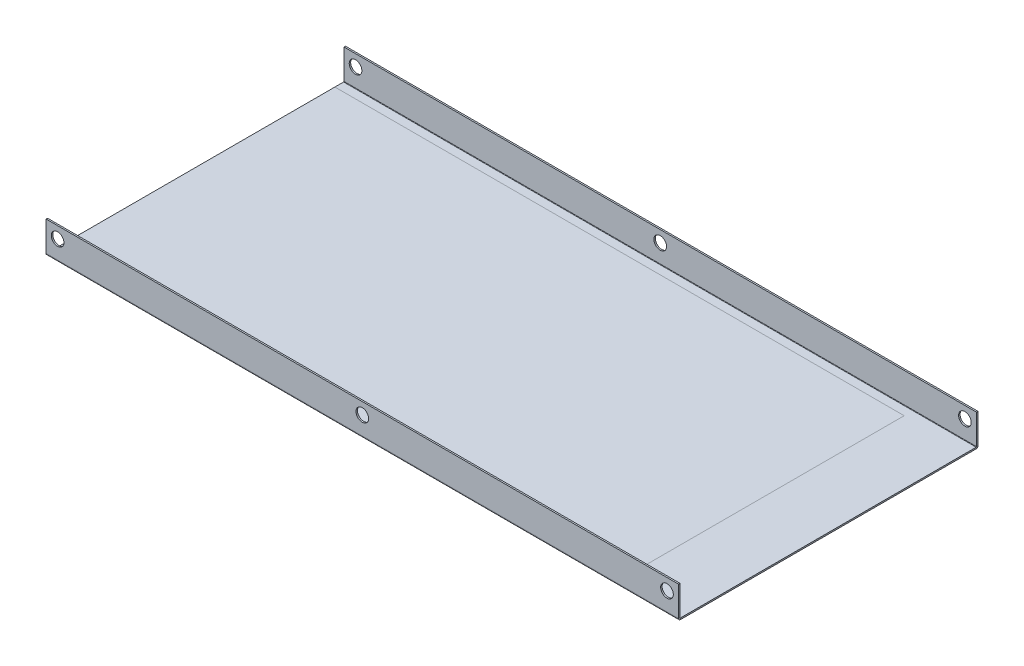
ISO-10303-21;
HEADER;
FILE_DESCRIPTION(('STEP AP214'),'2;1');
FILE_NAME('part.step','',(''),(''),'','','');
FILE_SCHEMA(('AUTOMOTIVE_DESIGN { 1 0 10303 214 1 1 1 1 }'));
ENDSEC;
DATA;
#1=APPLICATION_CONTEXT('core data for automotive mechanical design processes');
#2=APPLICATION_PROTOCOL_DEFINITION('international standard','automotive_design',2000,#1);
#3=PRODUCT_CONTEXT('',#1,'mechanical');
#4=PRODUCT('Part','Part','',(#3));
#5=PRODUCT_RELATED_PRODUCT_CATEGORY('part','',(#4));
#6=PRODUCT_DEFINITION_FORMATION('','',#4);
#7=PRODUCT_DEFINITION_CONTEXT('part definition',#1,'design');
#8=PRODUCT_DEFINITION('design','',#6,#7);
#9=PRODUCT_DEFINITION_SHAPE('','',#8);
#10=(LENGTH_UNIT() NAMED_UNIT(*) SI_UNIT(.MILLI.,.METRE.));
#11=(NAMED_UNIT(*) PLANE_ANGLE_UNIT() SI_UNIT($,.RADIAN.));
#12=(NAMED_UNIT(*) SI_UNIT($,.STERADIAN.) SOLID_ANGLE_UNIT());
#13=UNCERTAINTY_MEASURE_WITH_UNIT(LENGTH_MEASURE(1.E-05),#10,'distance_accuracy_value','');
#14=(GEOMETRIC_REPRESENTATION_CONTEXT(3) GLOBAL_UNCERTAINTY_ASSIGNED_CONTEXT((#13)) GLOBAL_UNIT_ASSIGNED_CONTEXT((#10,
#11,#12)) REPRESENTATION_CONTEXT('',''));
#15=CARTESIAN_POINT('',(0.,0.,0.));
#16=DIRECTION('',(0.,0.,1.));
#17=DIRECTION('',(1.,0.,0.));
#18=AXIS2_PLACEMENT_3D('',#15,#16,#17);
#19=CARTESIAN_POINT('',(-150.,-0.710000000000019,-66.));
#20=DIRECTION('',(0.,0.,1.));
#21=DIRECTION('',(1.,0.,0.));
#22=AXIS2_PLACEMENT_3D('',#19,#20,#21);
#23=PLANE('',#22);
#24=DIRECTION('',(-1.,0.,0.));
#25=VECTOR('',#24,1.);
#26=CARTESIAN_POINT('',(0.,-0.7,-66.));
#27=LINE('',#26,#25);
#28=CARTESIAN_POINT('',(120.,-0.7,-66.));
#29=VERTEX_POINT('',#28);
#30=CARTESIAN_POINT('',(-150.,-0.7,-66.));
#31=VERTEX_POINT('',#30);
#32=EDGE_CURVE('E255',#29,#31,#27,.T.);
#33=ORIENTED_EDGE('',*,*,#32,.F.);
#34=DIRECTION('',(0.,1.,0.));
#35=VECTOR('',#34,1.);
#36=CARTESIAN_POINT('',(120.,-0.710000000000019,-66.));
#37=LINE('',#36,#35);
#38=CARTESIAN_POINT('',(120.,0.,-66.));
#39=VERTEX_POINT('',#38);
#40=EDGE_CURVE('E100',#29,#39,#37,.T.);
#41=ORIENTED_EDGE('',*,*,#40,.T.);
#42=DIRECTION('',(-1.,0.,0.));
#43=VECTOR('',#42,1.);
#44=CARTESIAN_POINT('',(0.,0.,-66.));
#45=LINE('',#44,#43);
#46=CARTESIAN_POINT('',(-150.,0.,-66.));
#47=VERTEX_POINT('',#46);
#48=EDGE_CURVE('E261',#39,#47,#45,.T.);
#49=ORIENTED_EDGE('',*,*,#48,.T.);
#50=DIRECTION('',(0.,1.,0.));
#51=VECTOR('',#50,1.);
#52=CARTESIAN_POINT('',(-150.,-0.7,-66.));
#53=LINE('',#52,#51);
#54=EDGE_CURVE('E260',#31,#47,#53,.T.);
#55=ORIENTED_EDGE('',*,*,#54,.F.);
#56=EDGE_LOOP('',(#33,#41,#49,#55));
#57=FACE_BOUND('',#56,.T.);
#58=ADVANCED_FACE('F90',(#57),#23,.T.);
#59=CARTESIAN_POINT('',(120.,-0.710000000000019,66.));
#60=DIRECTION('',(0.,0.,-1.));
#61=DIRECTION('',(-1.,0.,0.));
#62=AXIS2_PLACEMENT_3D('',#59,#60,#61);
#63=PLANE('',#62);
#64=DIRECTION('',(1.,0.,0.));
#65=VECTOR('',#64,1.);
#66=CARTESIAN_POINT('',(0.,-0.7,66.));
#67=LINE('',#66,#65);
#68=CARTESIAN_POINT('',(-150.,-0.7,66.));
#69=VERTEX_POINT('',#68);
#70=CARTESIAN_POINT('',(120.,-0.7,66.));
#71=VERTEX_POINT('',#70);
#72=EDGE_CURVE('E258',#69,#71,#67,.T.);
#73=ORIENTED_EDGE('',*,*,#72,.F.);
#74=DIRECTION('',(0.,-1.,0.));
#75=VECTOR('',#74,1.);
#76=CARTESIAN_POINT('',(-150.,-0.7,66.));
#77=LINE('',#76,#75);
#78=CARTESIAN_POINT('',(-150.,0.,66.));
#79=VERTEX_POINT('',#78);
#80=EDGE_CURVE('E270',#79,#69,#77,.T.);
#81=ORIENTED_EDGE('',*,*,#80,.F.);
#82=DIRECTION('',(1.,0.,0.));
#83=VECTOR('',#82,1.);
#84=CARTESIAN_POINT('',(0.,0.,66.));
#85=LINE('',#84,#83);
#86=CARTESIAN_POINT('',(120.,0.,66.));
#87=VERTEX_POINT('',#86);
#88=EDGE_CURVE('E267',#79,#87,#85,.T.);
#89=ORIENTED_EDGE('',*,*,#88,.T.);
#90=DIRECTION('',(0.,1.,0.));
#91=VECTOR('',#90,1.);
#92=CARTESIAN_POINT('',(120.,-0.710000000000019,66.));
#93=LINE('',#92,#91);
#94=EDGE_CURVE('E14',#71,#87,#93,.T.);
#95=ORIENTED_EDGE('',*,*,#94,.F.);
#96=EDGE_LOOP('',(#73,#81,#89,#95));
#97=FACE_BOUND('',#96,.T.);
#98=ADVANCED_FACE('F495',(#97),#63,.T.);
#99=CARTESIAN_POINT('',(120.,-0.710000000000019,-66.));
#100=DIRECTION('',(-1.,0.,0.));
#101=DIRECTION('',(0.,0.,1.));
#102=AXIS2_PLACEMENT_3D('',#99,#100,#101);
#103=PLANE('',#102);
#104=DIRECTION('',(0.,0.,-1.));
#105=VECTOR('',#104,1.);
#106=CARTESIAN_POINT('',(120.,-0.7,0.));
#107=LINE('',#106,#105);
#108=EDGE_CURVE('E241',#71,#29,#107,.T.);
#109=ORIENTED_EDGE('',*,*,#108,.F.);
#110=ORIENTED_EDGE('',*,*,#94,.T.);
#111=DIRECTION('',(0.,0.,-1.));
#112=VECTOR('',#111,1.);
#113=CARTESIAN_POINT('',(120.,0.,0.));
#114=LINE('',#113,#112);
#115=EDGE_CURVE('E243',#87,#39,#114,.T.);
#116=ORIENTED_EDGE('',*,*,#115,.T.);
#117=ORIENTED_EDGE('',*,*,#40,.F.);
#118=EDGE_LOOP('',(#109,#110,#116,#117));
#119=FACE_BOUND('',#118,.T.);
#120=ADVANCED_FACE('F240',(#119),#103,.T.);
#121=CARTESIAN_POINT('',(-144.5,8.80000000000007,-61.));
#122=DIRECTION('',(0.,0.,-1.));
#123=DIRECTION('',(0.,1.,0.));
#124=AXIS2_PLACEMENT_3D('',#121,#122,#123);
#125=CYLINDRICAL_SURFACE('',#124,2.99999999999999);
#126=CARTESIAN_POINT('',(-144.5,8.80000000000004,-70.3));
#127=DIRECTION('',(0.,0.,1.));
#128=DIRECTION('',(0.,-1.,0.));
#129=AXIS2_PLACEMENT_3D('',#126,#127,#128);
#130=CIRCLE('',#129,2.99999999999999);
#131=CARTESIAN_POINT('',(-144.5,5.80000000000004,-70.3));
#132=VERTEX_POINT('',#131);
#133=EDGE_CURVE('E291',#132,#132,#130,.T.);
#134=ORIENTED_EDGE('',*,*,#133,.T.);
#135=EDGE_LOOP('',(#134));
#136=FACE_BOUND('',#135,.T.);
#137=CARTESIAN_POINT('',(-144.5,8.80000000000003,-71.));
#138=DIRECTION('',(0.,0.,-1.));
#139=DIRECTION('',(0.,-1.,0.));
#140=AXIS2_PLACEMENT_3D('',#137,#138,#139);
#141=CIRCLE('',#140,2.99999999999999);
#142=CARTESIAN_POINT('',(-144.5,5.80000000000004,-71.));
#143=VERTEX_POINT('',#142);
#144=EDGE_CURVE('E294',#143,#143,#141,.T.);
#145=ORIENTED_EDGE('',*,*,#144,.T.);
#146=EDGE_LOOP('',(#145));
#147=FACE_BOUND('',#146,.T.);
#148=ADVANCED_FACE('F482',(#136,#147),#125,.F.);
#149=CARTESIAN_POINT('',(0.,8.80000000000004,-61.));
#150=DIRECTION('',(0.,0.,-1.));
#151=DIRECTION('',(0.,1.,0.));
#152=AXIS2_PLACEMENT_3D('',#149,#150,#151);
#153=CYLINDRICAL_SURFACE('',#152,3.);
#154=CARTESIAN_POINT('',(0.,8.80000000000001,-70.3));
#155=DIRECTION('',(0.,0.,1.));
#156=DIRECTION('',(0.,-1.,0.));
#157=AXIS2_PLACEMENT_3D('',#154,#155,#156);
#158=CIRCLE('',#157,3.);
#159=CARTESIAN_POINT('',(0.,5.80000000000001,-70.3));
#160=VERTEX_POINT('',#159);
#161=EDGE_CURVE('E390',#160,#160,#158,.T.);
#162=ORIENTED_EDGE('',*,*,#161,.T.);
#163=EDGE_LOOP('',(#162));
#164=FACE_BOUND('',#163,.T.);
#165=CARTESIAN_POINT('',(0.,8.80000000000001,-71.));
#166=DIRECTION('',(0.,0.,-1.));
#167=DIRECTION('',(0.,1.,0.));
#168=AXIS2_PLACEMENT_3D('',#165,#166,#167);
#169=CIRCLE('',#168,3.);
#170=CARTESIAN_POINT('',(0.,11.8,-71.));
#171=VERTEX_POINT('',#170);
#172=EDGE_CURVE('E290',#171,#171,#169,.T.);
#173=ORIENTED_EDGE('',*,*,#172,.T.);
#174=EDGE_LOOP('',(#173));
#175=FACE_BOUND('',#174,.T.);
#176=ADVANCED_FACE('F484',(#164,#175),#153,.F.);
#177=CARTESIAN_POINT('',(144.5,8.80000000000004,-61.));
#178=DIRECTION('',(0.,0.,-1.));
#179=DIRECTION('',(0.,1.,0.));
#180=AXIS2_PLACEMENT_3D('',#177,#178,#179);
#181=CYLINDRICAL_SURFACE('',#180,2.99999999999999);
#182=CARTESIAN_POINT('',(144.5,8.8,-70.3));
#183=DIRECTION('',(0.,0.,1.));
#184=DIRECTION('',(0.,-1.,0.));
#185=AXIS2_PLACEMENT_3D('',#182,#183,#184);
#186=CIRCLE('',#185,2.99999999999999);
#187=CARTESIAN_POINT('',(144.5,5.80000000000001,-70.3));
#188=VERTEX_POINT('',#187);
#189=EDGE_CURVE('E323',#188,#188,#186,.T.);
#190=ORIENTED_EDGE('',*,*,#189,.T.);
#191=EDGE_LOOP('',(#190));
#192=FACE_BOUND('',#191,.T.);
#193=CARTESIAN_POINT('',(144.5,8.8,-71.));
#194=DIRECTION('',(0.,0.,-1.));
#195=DIRECTION('',(0.,1.,0.));
#196=AXIS2_PLACEMENT_3D('',#193,#194,#195);
#197=CIRCLE('',#196,2.99999999999999);
#198=CARTESIAN_POINT('',(144.5,11.8,-71.));
#199=VERTEX_POINT('',#198);
#200=EDGE_CURVE('E287',#199,#199,#197,.T.);
#201=ORIENTED_EDGE('',*,*,#200,.T.);
#202=EDGE_LOOP('',(#201));
#203=FACE_BOUND('',#202,.T.);
#204=ADVANCED_FACE('F491',(#192,#203),#181,.F.);
#205=CARTESIAN_POINT('',(150.,0.,-71.));
#206=DIRECTION('',(-1.,0.,0.));
#207=DIRECTION('',(0.,0.,1.));
#208=AXIS2_PLACEMENT_3D('',#205,#206,#207);
#209=PLANE('',#208);
#210=DIRECTION('',(0.,0.,1.));
#211=VECTOR('',#210,1.);
#212=CARTESIAN_POINT('',(150.,0.200000000000011,-71.));
#213=LINE('',#212,#211);
#214=CARTESIAN_POINT('',(150.,0.200000000000007,-70.3));
#215=VERTEX_POINT('',#214);
#216=CARTESIAN_POINT('',(150.,0.200000000000004,-71.));
#217=VERTEX_POINT('',#216);
#218=EDGE_CURVE('E190',#215,#217,#213,.F.);
#219=ORIENTED_EDGE('',*,*,#218,.T.);
#220=DIRECTION('',(0.,-1.,0.));
#221=VECTOR('',#220,1.);
#222=CARTESIAN_POINT('',(150.,-2.78058843749729E-13,-71.));
#223=LINE('',#222,#221);
#224=CARTESIAN_POINT('',(150.,14.3,-71.));
#225=VERTEX_POINT('',#224);
#226=EDGE_CURVE('E348',#225,#217,#223,.T.);
#227=ORIENTED_EDGE('',*,*,#226,.F.);
#228=DIRECTION('',(0.,0.,1.));
#229=VECTOR('',#228,1.);
#230=CARTESIAN_POINT('',(150.,14.3,-71.));
#231=LINE('',#230,#229);
#232=CARTESIAN_POINT('',(150.,14.3,-70.3));
#233=VERTEX_POINT('',#232);
#234=EDGE_CURVE('E344',#225,#233,#231,.T.);
#235=ORIENTED_EDGE('',*,*,#234,.T.);
#236=DIRECTION('',(0.,1.,0.));
#237=VECTOR('',#236,1.);
#238=CARTESIAN_POINT('',(150.,0.,-70.3));
#239=LINE('',#238,#237);
#240=EDGE_CURVE('E353',#233,#215,#239,.F.);
#241=ORIENTED_EDGE('',*,*,#240,.T.);
#242=EDGE_LOOP('',(#219,#227,#235,#241));
#243=FACE_BOUND('',#242,.T.);
#244=ADVANCED_FACE('F460',(#243),#209,.F.);
#245=CARTESIAN_POINT('',(150.,14.3,71.));
#246=DIRECTION('',(-1.,0.,0.));
#247=DIRECTION('',(0.,0.,1.));
#248=AXIS2_PLACEMENT_3D('',#245,#246,#247);
#249=PLANE('',#248);
#250=DIRECTION('',(0.,0.,-1.));
#251=VECTOR('',#250,1.);
#252=CARTESIAN_POINT('',(150.,0.20000000000002,70.3));
#253=LINE('',#252,#251);
#254=CARTESIAN_POINT('',(150.,0.200000000000013,70.3));
#255=VERTEX_POINT('',#254);
#256=CARTESIAN_POINT('',(150.,0.20000000000002,71.));
#257=VERTEX_POINT('',#256);
#258=EDGE_CURVE('E318',#255,#257,#253,.F.);
#259=ORIENTED_EDGE('',*,*,#258,.F.);
#260=DIRECTION('',(0.,-1.,0.));
#261=VECTOR('',#260,1.);
#262=CARTESIAN_POINT('',(150.,14.3,70.3));
#263=LINE('',#262,#261);
#264=CARTESIAN_POINT('',(150.,14.3,70.3));
#265=VERTEX_POINT('',#264);
#266=EDGE_CURVE('E314',#255,#265,#263,.F.);
#267=ORIENTED_EDGE('',*,*,#266,.T.);
#268=DIRECTION('',(0.,0.,-1.));
#269=VECTOR('',#268,1.);
#270=CARTESIAN_POINT('',(150.,14.3,71.));
#271=LINE('',#270,#269);
#272=CARTESIAN_POINT('',(150.,14.3,71.));
#273=VERTEX_POINT('',#272);
#274=EDGE_CURVE('E298',#273,#265,#271,.T.);
#275=ORIENTED_EDGE('',*,*,#274,.F.);
#276=DIRECTION('',(0.,1.,0.));
#277=VECTOR('',#276,1.);
#278=CARTESIAN_POINT('',(150.,0.,71.));
#279=LINE('',#278,#277);
#280=EDGE_CURVE('E125',#257,#273,#279,.T.);
#281=ORIENTED_EDGE('',*,*,#280,.F.);
#282=EDGE_LOOP('',(#259,#267,#275,#281));
#283=FACE_BOUND('',#282,.T.);
#284=ADVANCED_FACE('F422',(#283),#249,.F.);
#285=CARTESIAN_POINT('',(144.5,8.80000000000004,61.));
#286=DIRECTION('',(0.,0.,1.));
#287=DIRECTION('',(1.,0.,0.));
#288=AXIS2_PLACEMENT_3D('',#285,#286,#287);
#289=CYLINDRICAL_SURFACE('',#288,2.99999999999999);
#290=CARTESIAN_POINT('',(144.5,8.80000000000004,70.3));
#291=DIRECTION('',(0.,0.,-1.));
#292=DIRECTION('',(-1.,0.,0.));
#293=AXIS2_PLACEMENT_3D('',#290,#291,#292);
#294=CIRCLE('',#293,2.99999999999999);
#295=CARTESIAN_POINT('',(141.5,8.80000000000004,70.3));
#296=VERTEX_POINT('',#295);
#297=EDGE_CURVE('E282',#296,#296,#294,.T.);
#298=ORIENTED_EDGE('',*,*,#297,.T.);
#299=EDGE_LOOP('',(#298));
#300=FACE_BOUND('',#299,.T.);
#301=CARTESIAN_POINT('',(144.5,8.80000000000004,71.));
#302=DIRECTION('',(0.,0.,1.));
#303=DIRECTION('',(-1.,0.,0.));
#304=AXIS2_PLACEMENT_3D('',#301,#302,#303);
#305=CIRCLE('',#304,2.99999999999999);
#306=CARTESIAN_POINT('',(141.5,8.80000000000004,71.));
#307=VERTEX_POINT('',#306);
#308=EDGE_CURVE('E248',#307,#307,#305,.T.);
#309=ORIENTED_EDGE('',*,*,#308,.T.);
#310=EDGE_LOOP('',(#309));
#311=FACE_BOUND('',#310,.T.);
#312=ADVANCED_FACE('F503',(#300,#311),#289,.F.);
#313=CARTESIAN_POINT('',(0.,8.80000000000001,61.));
#314=DIRECTION('',(0.,0.,1.));
#315=DIRECTION('',(1.,0.,0.));
#316=AXIS2_PLACEMENT_3D('',#313,#314,#315);
#317=CYLINDRICAL_SURFACE('',#316,3.);
#318=CARTESIAN_POINT('',(0.,8.80000000000001,70.3));
#319=DIRECTION('',(0.,0.,-1.));
#320=DIRECTION('',(-1.,0.,0.));
#321=AXIS2_PLACEMENT_3D('',#318,#319,#320);
#322=CIRCLE('',#321,3.);
#323=CARTESIAN_POINT('',(-3.,8.80000000000001,70.3));
#324=VERTEX_POINT('',#323);
#325=EDGE_CURVE('E397',#324,#324,#322,.T.);
#326=ORIENTED_EDGE('',*,*,#325,.T.);
#327=EDGE_LOOP('',(#326));
#328=FACE_BOUND('',#327,.T.);
#329=CARTESIAN_POINT('',(0.,8.80000000000001,71.));
#330=DIRECTION('',(0.,0.,1.));
#331=DIRECTION('',(1.,0.,0.));
#332=AXIS2_PLACEMENT_3D('',#329,#330,#331);
#333=CIRCLE('',#332,3.);
#334=CARTESIAN_POINT('',(3.,8.80000000000001,71.));
#335=VERTEX_POINT('',#334);
#336=EDGE_CURVE('E281',#335,#335,#333,.T.);
#337=ORIENTED_EDGE('',*,*,#336,.T.);
#338=EDGE_LOOP('',(#337));
#339=FACE_BOUND('',#338,.T.);
#340=ADVANCED_FACE('F506',(#328,#339),#317,.F.);
#341=CARTESIAN_POINT('',(-144.5,8.8,61.));
#342=DIRECTION('',(0.,0.,1.));
#343=DIRECTION('',(1.,0.,0.));
#344=AXIS2_PLACEMENT_3D('',#341,#342,#343);
#345=CYLINDRICAL_SURFACE('',#344,2.99999999999999);
#346=CARTESIAN_POINT('',(-144.5,8.8,70.3));
#347=DIRECTION('',(0.,0.,-1.));
#348=DIRECTION('',(-1.,0.,0.));
#349=AXIS2_PLACEMENT_3D('',#346,#347,#348);
#350=CIRCLE('',#349,2.99999999999999);
#351=CARTESIAN_POINT('',(-147.5,8.8,70.3));
#352=VERTEX_POINT('',#351);
#353=EDGE_CURVE('E297',#352,#352,#350,.T.);
#354=ORIENTED_EDGE('',*,*,#353,.T.);
#355=EDGE_LOOP('',(#354));
#356=FACE_BOUND('',#355,.T.);
#357=CARTESIAN_POINT('',(-144.5,8.8,71.));
#358=DIRECTION('',(0.,0.,1.));
#359=DIRECTION('',(1.,0.,0.));
#360=AXIS2_PLACEMENT_3D('',#357,#358,#359);
#361=CIRCLE('',#360,2.99999999999999);
#362=CARTESIAN_POINT('',(-141.5,8.8,71.));
#363=VERTEX_POINT('',#362);
#364=EDGE_CURVE('E278',#363,#363,#361,.T.);
#365=ORIENTED_EDGE('',*,*,#364,.T.);
#366=EDGE_LOOP('',(#365));
#367=FACE_BOUND('',#366,.T.);
#368=ADVANCED_FACE('F403',(#356,#367),#345,.F.);
#369=CARTESIAN_POINT('',(150.,14.3,-71.));
#370=DIRECTION('',(0.,-1.,0.));
#371=DIRECTION('',(0.,0.,-1.));
#372=AXIS2_PLACEMENT_3D('',#369,#370,#371);
#373=PLANE('',#372);
#374=DIRECTION('',(-1.,0.,0.));
#375=VECTOR('',#374,1.);
#376=CARTESIAN_POINT('',(150.,14.3,-70.3));
#377=LINE('',#376,#375);
#378=CARTESIAN_POINT('',(-150.,14.3,-70.3));
#379=VERTEX_POINT('',#378);
#380=EDGE_CURVE('E356',#379,#233,#377,.F.);
#381=ORIENTED_EDGE('',*,*,#380,.T.);
#382=ORIENTED_EDGE('',*,*,#234,.F.);
#383=DIRECTION('',(1.,0.,0.));
#384=VECTOR('',#383,1.);
#385=CARTESIAN_POINT('',(0.,14.3,-71.));
#386=LINE('',#385,#384);
#387=CARTESIAN_POINT('',(-150.,14.3,-71.));
#388=VERTEX_POINT('',#387);
#389=EDGE_CURVE('E181',#388,#225,#386,.T.);
#390=ORIENTED_EDGE('',*,*,#389,.F.);
#391=DIRECTION('',(0.,0.,1.));
#392=VECTOR('',#391,1.);
#393=CARTESIAN_POINT('',(-150.,14.3,-71.));
#394=LINE('',#393,#392);
#395=EDGE_CURVE('E341',#388,#379,#394,.T.);
#396=ORIENTED_EDGE('',*,*,#395,.T.);
#397=EDGE_LOOP('',(#381,#382,#390,#396));
#398=FACE_BOUND('',#397,.T.);
#399=ADVANCED_FACE('F463',(#398),#373,.F.);
#400=CARTESIAN_POINT('',(-150.,14.3,71.));
#401=DIRECTION('',(0.,-1.,0.));
#402=DIRECTION('',(0.,0.,-1.));
#403=AXIS2_PLACEMENT_3D('',#400,#401,#402);
#404=PLANE('',#403);
#405=DIRECTION('',(1.,0.,0.));
#406=VECTOR('',#405,1.);
#407=CARTESIAN_POINT('',(-150.,14.3,70.3));
#408=LINE('',#407,#406);
#409=CARTESIAN_POINT('',(-150.,14.3,70.3));
#410=VERTEX_POINT('',#409);
#411=EDGE_CURVE('E312',#265,#410,#408,.F.);
#412=ORIENTED_EDGE('',*,*,#411,.T.);
#413=DIRECTION('',(0.,0.,-1.));
#414=VECTOR('',#413,1.);
#415=CARTESIAN_POINT('',(-150.,14.3,71.));
#416=LINE('',#415,#414);
#417=CARTESIAN_POINT('',(-150.,14.3,71.));
#418=VERTEX_POINT('',#417);
#419=EDGE_CURVE('E301',#418,#410,#416,.T.);
#420=ORIENTED_EDGE('',*,*,#419,.F.);
#421=DIRECTION('',(-1.,0.,0.));
#422=VECTOR('',#421,1.);
#423=CARTESIAN_POINT('',(0.,14.3,71.));
#424=LINE('',#423,#422);
#425=EDGE_CURVE('E130',#273,#418,#424,.T.);
#426=ORIENTED_EDGE('',*,*,#425,.F.);
#427=ORIENTED_EDGE('',*,*,#274,.T.);
#428=EDGE_LOOP('',(#412,#420,#426,#427));
#429=FACE_BOUND('',#428,.T.);
#430=ADVANCED_FACE('F424',(#429),#404,.F.);
#431=CARTESIAN_POINT('',(0.,0.,71.));
#432=DIRECTION('',(0.,0.,-1.));
#433=DIRECTION('',(-1.,0.,0.));
#434=AXIS2_PLACEMENT_3D('',#431,#432,#433);
#435=PLANE('',#434);
#436=ORIENTED_EDGE('',*,*,#364,.F.);
#437=EDGE_LOOP('',(#436));
#438=FACE_BOUND('',#437,.T.);
#439=ORIENTED_EDGE('',*,*,#336,.F.);
#440=EDGE_LOOP('',(#439));
#441=FACE_BOUND('',#440,.T.);
#442=ORIENTED_EDGE('',*,*,#308,.F.);
#443=EDGE_LOOP('',(#442));
#444=FACE_BOUND('',#443,.T.);
#445=DIRECTION('',(1.,0.,0.));
#446=VECTOR('',#445,1.);
#447=CARTESIAN_POINT('',(-150.,0.200000000000006,71.));
#448=LINE('',#447,#446);
#449=CARTESIAN_POINT('',(-150.,0.200000000000013,71.));
#450=VERTEX_POINT('',#449);
#451=EDGE_CURVE('E316',#257,#450,#448,.F.);
#452=ORIENTED_EDGE('',*,*,#451,.F.);
#453=ORIENTED_EDGE('',*,*,#280,.T.);
#454=ORIENTED_EDGE('',*,*,#425,.T.);
#455=DIRECTION('',(0.,-1.,0.));
#456=VECTOR('',#455,1.);
#457=CARTESIAN_POINT('',(-150.,0.,71.));
#458=LINE('',#457,#456);
#459=EDGE_CURVE('E305',#418,#450,#458,.T.);
#460=ORIENTED_EDGE('',*,*,#459,.T.);
#461=EDGE_LOOP('',(#452,#453,#454,#460));
#462=FACE_BOUND('',#461,.T.);
#463=ADVANCED_FACE('F428',(#438,#441,#444,#462),#435,.F.);
#464=CARTESIAN_POINT('',(0.,-2.78058843749729E-13,-71.));
#465=DIRECTION('',(0.,0.,1.));
#466=DIRECTION('',(0.,-1.,0.));
#467=AXIS2_PLACEMENT_3D('',#464,#465,#466);
#468=PLANE('',#467);
#469=ORIENTED_EDGE('',*,*,#200,.F.);
#470=EDGE_LOOP('',(#469));
#471=FACE_BOUND('',#470,.T.);
#472=ORIENTED_EDGE('',*,*,#172,.F.);
#473=EDGE_LOOP('',(#472));
#474=FACE_BOUND('',#473,.T.);
#475=ORIENTED_EDGE('',*,*,#144,.F.);
#476=EDGE_LOOP('',(#475));
#477=FACE_BOUND('',#476,.T.);
#478=DIRECTION('',(-1.,0.,0.));
#479=VECTOR('',#478,1.);
#480=CARTESIAN_POINT('',(150.,0.200000000000011,-71.));
#481=LINE('',#480,#479);
#482=CARTESIAN_POINT('',(-150.,0.199999999999997,-71.));
#483=VERTEX_POINT('',#482);
#484=EDGE_CURVE('E360',#483,#217,#481,.F.);
#485=ORIENTED_EDGE('',*,*,#484,.F.);
#486=DIRECTION('',(0.,1.,0.));
#487=VECTOR('',#486,1.);
#488=CARTESIAN_POINT('',(-150.,-2.78058843749729E-13,-71.));
#489=LINE('',#488,#487);
#490=EDGE_CURVE('E351',#483,#388,#489,.T.);
#491=ORIENTED_EDGE('',*,*,#490,.T.);
#492=ORIENTED_EDGE('',*,*,#389,.T.);
#493=ORIENTED_EDGE('',*,*,#226,.T.);
#494=EDGE_LOOP('',(#485,#491,#492,#493));
#495=FACE_BOUND('',#494,.T.);
#496=ADVANCED_FACE('F468',(#471,#474,#477,#495),#468,.F.);
#497=CARTESIAN_POINT('',(0.,-2.75614806812539E-13,-70.3));
#498=DIRECTION('',(0.,0.,1.));
#499=DIRECTION('',(0.,-1.,0.));
#500=AXIS2_PLACEMENT_3D('',#497,#498,#499);
#501=PLANE('',#500);
#502=ORIENTED_EDGE('',*,*,#189,.F.);
#503=EDGE_LOOP('',(#502));
#504=FACE_BOUND('',#503,.T.);
#505=ORIENTED_EDGE('',*,*,#161,.F.);
#506=EDGE_LOOP('',(#505));
#507=FACE_BOUND('',#506,.T.);
#508=ORIENTED_EDGE('',*,*,#133,.F.);
#509=EDGE_LOOP('',(#508));
#510=FACE_BOUND('',#509,.T.);
#511=DIRECTION('',(0.,-1.,0.));
#512=VECTOR('',#511,1.);
#513=CARTESIAN_POINT('',(-150.,14.3,-70.3));
#514=LINE('',#513,#512);
#515=CARTESIAN_POINT('',(-150.,0.199999999999986,-70.3));
#516=VERTEX_POINT('',#515);
#517=EDGE_CURVE('E358',#516,#379,#514,.F.);
#518=ORIENTED_EDGE('',*,*,#517,.F.);
#519=DIRECTION('',(-1.,0.,0.));
#520=VECTOR('',#519,1.);
#521=CARTESIAN_POINT('',(150.,0.200000000000006,-70.3));
#522=LINE('',#521,#520);
#523=EDGE_CURVE('E364',#215,#516,#522,.T.);
#524=ORIENTED_EDGE('',*,*,#523,.F.);
#525=ORIENTED_EDGE('',*,*,#240,.F.);
#526=ORIENTED_EDGE('',*,*,#380,.F.);
#527=EDGE_LOOP('',(#518,#524,#525,#526));
#528=FACE_BOUND('',#527,.T.);
#529=ADVANCED_FACE('F457',(#504,#507,#510,#528),#501,.T.);
#530=CARTESIAN_POINT('',(150.,0.200000000000008,-70.1));
#531=DIRECTION('',(1.,0.,0.));
#532=DIRECTION('',(0.,1.,0.));
#533=AXIS2_PLACEMENT_3D('',#530,#531,#532);
#534=PLANE('',#533);
#535=ORIENTED_EDGE('',*,*,#218,.F.);
#536=CARTESIAN_POINT('',(150.,0.200000000000008,-70.1));
#537=DIRECTION('',(-1.,0.,0.));
#538=DIRECTION('',(0.,-1.,0.));
#539=AXIS2_PLACEMENT_3D('',#536,#537,#538);
#540=CIRCLE('',#539,0.200000000000006);
#541=CARTESIAN_POINT('',(150.,0.,-70.1));
#542=VERTEX_POINT('',#541);
#543=EDGE_CURVE('E372',#542,#215,#540,.F.);
#544=ORIENTED_EDGE('',*,*,#543,.F.);
#545=DIRECTION('',(0.,-1.,0.));
#546=VECTOR('',#545,1.);
#547=CARTESIAN_POINT('',(150.,0.,-70.1));
#548=LINE('',#547,#546);
#549=CARTESIAN_POINT('',(150.,-0.7,-70.1));
#550=VERTEX_POINT('',#549);
#551=EDGE_CURVE('E378',#542,#550,#548,.T.);
#552=ORIENTED_EDGE('',*,*,#551,.T.);
#553=CARTESIAN_POINT('',(150.,0.200000000000008,-70.1));
#554=DIRECTION('',(-1.,0.,0.));
#555=DIRECTION('',(0.,-1.,0.));
#556=AXIS2_PLACEMENT_3D('',#553,#554,#555);
#557=CIRCLE('',#556,0.900000000000006);
#558=EDGE_CURVE('E368',#550,#217,#557,.F.);
#559=ORIENTED_EDGE('',*,*,#558,.T.);
#560=EDGE_LOOP('',(#535,#544,#552,#559));
#561=FACE_BOUND('',#560,.T.);
#562=ADVANCED_FACE('F470',(#561),#534,.T.);
#563=CARTESIAN_POINT('',(150.,0.200000000000013,70.1));
#564=DIRECTION('',(-1.,0.,0.));
#565=DIRECTION('',(0.,0.,1.));
#566=AXIS2_PLACEMENT_3D('',#563,#564,#565);
#567=PLANE('',#566);
#568=CARTESIAN_POINT('',(150.,0.200000000000013,70.1));
#569=DIRECTION('',(1.,0.,0.));
#570=DIRECTION('',(0.,0.,-1.));
#571=AXIS2_PLACEMENT_3D('',#568,#569,#570);
#572=CIRCLE('',#571,0.200000000000006);
#573=CARTESIAN_POINT('',(150.,0.,70.1));
#574=VERTEX_POINT('',#573);
#575=EDGE_CURVE('E302',#255,#574,#572,.T.);
#576=ORIENTED_EDGE('',*,*,#575,.F.);
#577=ORIENTED_EDGE('',*,*,#258,.T.);
#578=CARTESIAN_POINT('',(150.,0.200000000000013,70.1));
#579=DIRECTION('',(1.,0.,0.));
#580=DIRECTION('',(0.,0.,-1.));
#581=AXIS2_PLACEMENT_3D('',#578,#579,#580);
#582=CIRCLE('',#581,0.900000000000006);
#583=CARTESIAN_POINT('',(150.,-0.699999999999993,70.1));
#584=VERTEX_POINT('',#583);
#585=EDGE_CURVE('E109',#257,#584,#582,.T.);
#586=ORIENTED_EDGE('',*,*,#585,.T.);
#587=DIRECTION('',(0.,-1.,0.));
#588=VECTOR('',#587,1.);
#589=CARTESIAN_POINT('',(150.,0.,70.1));
#590=LINE('',#589,#588);
#591=EDGE_CURVE('E327',#574,#584,#590,.T.);
#592=ORIENTED_EDGE('',*,*,#591,.F.);
#593=EDGE_LOOP('',(#576,#577,#586,#592));
#594=FACE_BOUND('',#593,.T.);
#595=ADVANCED_FACE('F410',(#594),#567,.F.);
#596=CARTESIAN_POINT('',(0.,0.,70.3));
#597=DIRECTION('',(0.,0.,-1.));
#598=DIRECTION('',(-1.,0.,0.));
#599=AXIS2_PLACEMENT_3D('',#596,#597,#598);
#600=PLANE('',#599);
#601=ORIENTED_EDGE('',*,*,#353,.F.);
#602=EDGE_LOOP('',(#601));
#603=FACE_BOUND('',#602,.T.);
#604=ORIENTED_EDGE('',*,*,#325,.F.);
#605=EDGE_LOOP('',(#604));
#606=FACE_BOUND('',#605,.T.);
#607=ORIENTED_EDGE('',*,*,#297,.F.);
#608=EDGE_LOOP('',(#607));
#609=FACE_BOUND('',#608,.T.);
#610=ORIENTED_EDGE('',*,*,#266,.F.);
#611=DIRECTION('',(1.,0.,0.));
#612=VECTOR('',#611,1.);
#613=CARTESIAN_POINT('',(-150.,0.200000000000006,70.3));
#614=LINE('',#613,#612);
#615=CARTESIAN_POINT('',(-150.,0.200000000000013,70.3));
#616=VERTEX_POINT('',#615);
#617=EDGE_CURVE('E320',#616,#255,#614,.T.);
#618=ORIENTED_EDGE('',*,*,#617,.F.);
#619=DIRECTION('',(0.,1.,0.));
#620=VECTOR('',#619,1.);
#621=CARTESIAN_POINT('',(-150.,0.,70.3));
#622=LINE('',#621,#620);
#623=EDGE_CURVE('E309',#410,#616,#622,.F.);
#624=ORIENTED_EDGE('',*,*,#623,.F.);
#625=ORIENTED_EDGE('',*,*,#411,.F.);
#626=EDGE_LOOP('',(#610,#618,#624,#625));
#627=FACE_BOUND('',#626,.T.);
#628=ADVANCED_FACE('F406',(#603,#606,#609,#627),#600,.T.);
#629=CARTESIAN_POINT('',(-150.,14.3,-71.));
#630=DIRECTION('',(1.,0.,0.));
#631=DIRECTION('',(0.,0.,-1.));
#632=AXIS2_PLACEMENT_3D('',#629,#630,#631);
#633=PLANE('',#632);
#634=DIRECTION('',(0.,0.,1.));
#635=VECTOR('',#634,1.);
#636=CARTESIAN_POINT('',(-150.,0.199999999999992,-70.3));
#637=LINE('',#636,#635);
#638=EDGE_CURVE('E362',#516,#483,#637,.F.);
#639=ORIENTED_EDGE('',*,*,#638,.F.);
#640=ORIENTED_EDGE('',*,*,#517,.T.);
#641=ORIENTED_EDGE('',*,*,#395,.F.);
#642=ORIENTED_EDGE('',*,*,#490,.F.);
#643=EDGE_LOOP('',(#639,#640,#641,#642));
#644=FACE_BOUND('',#643,.T.);
#645=ADVANCED_FACE('F409',(#644),#633,.F.);
#646=CARTESIAN_POINT('',(-150.,0.,71.));
#647=DIRECTION('',(1.,0.,0.));
#648=DIRECTION('',(0.,0.,-1.));
#649=AXIS2_PLACEMENT_3D('',#646,#647,#648);
#650=PLANE('',#649);
#651=DIRECTION('',(0.,0.,-1.));
#652=VECTOR('',#651,1.);
#653=CARTESIAN_POINT('',(-150.,0.200000000000006,71.));
#654=LINE('',#653,#652);
#655=EDGE_CURVE('E139',#616,#450,#654,.F.);
#656=ORIENTED_EDGE('',*,*,#655,.T.);
#657=ORIENTED_EDGE('',*,*,#459,.F.);
#658=ORIENTED_EDGE('',*,*,#419,.T.);
#659=ORIENTED_EDGE('',*,*,#623,.T.);
#660=EDGE_LOOP('',(#656,#657,#658,#659));
#661=FACE_BOUND('',#660,.T.);
#662=ADVANCED_FACE('F427',(#661),#650,.F.);
#663=CARTESIAN_POINT('',(150.,0.200000000000013,70.1));
#664=DIRECTION('',(1.,0.,0.));
#665=DIRECTION('',(0.,0.,1.));
#666=AXIS2_PLACEMENT_3D('',#663,#664,#665);
#667=CYLINDRICAL_SURFACE('',#666,0.900000000000006);
#668=DIRECTION('',(1.,0.,0.));
#669=VECTOR('',#668,1.);
#670=CARTESIAN_POINT('',(150.,-0.699999999999993,70.1));
#671=LINE('',#670,#669);
#672=CARTESIAN_POINT('',(-150.,-0.7,70.1));
#673=VERTEX_POINT('',#672);
#674=EDGE_CURVE('E154',#584,#673,#671,.F.);
#675=ORIENTED_EDGE('',*,*,#674,.F.);
#676=ORIENTED_EDGE('',*,*,#585,.F.);
#677=ORIENTED_EDGE('',*,*,#451,.T.);
#678=CARTESIAN_POINT('',(-150.,0.200000000000013,70.1));
#679=DIRECTION('',(1.,0.,0.));
#680=DIRECTION('',(0.,0.,-1.));
#681=AXIS2_PLACEMENT_3D('',#678,#679,#680);
#682=CIRCLE('',#681,0.900000000000006);
#683=EDGE_CURVE('E325',#673,#450,#682,.F.);
#684=ORIENTED_EDGE('',*,*,#683,.F.);
#685=EDGE_LOOP('',(#675,#676,#677,#684));
#686=FACE_BOUND('',#685,.T.);
#687=ADVANCED_FACE('F429',(#686),#667,.T.);
#688=CARTESIAN_POINT('',(-150.,0.199999999999987,-70.1));
#689=DIRECTION('',(-1.,0.,0.));
#690=DIRECTION('',(0.,0.,-1.));
#691=AXIS2_PLACEMENT_3D('',#688,#689,#690);
#692=CYLINDRICAL_SURFACE('',#691,0.900000000000006);
#693=DIRECTION('',(-1.,0.,0.));
#694=VECTOR('',#693,1.);
#695=CARTESIAN_POINT('',(-150.,-0.700000000000018,-70.1));
#696=LINE('',#695,#694);
#697=CARTESIAN_POINT('',(-150.,-0.700000000000018,-70.1));
#698=VERTEX_POINT('',#697);
#699=EDGE_CURVE('E205',#698,#550,#696,.F.);
#700=ORIENTED_EDGE('',*,*,#699,.F.);
#701=CARTESIAN_POINT('',(-150.,0.199999999999987,-70.1));
#702=DIRECTION('',(-1.,0.,0.));
#703=DIRECTION('',(0.,-1.,0.));
#704=AXIS2_PLACEMENT_3D('',#701,#702,#703);
#705=CIRCLE('',#704,0.900000000000006);
#706=EDGE_CURVE('E162',#483,#698,#705,.T.);
#707=ORIENTED_EDGE('',*,*,#706,.F.);
#708=ORIENTED_EDGE('',*,*,#484,.T.);
#709=ORIENTED_EDGE('',*,*,#558,.F.);
#710=EDGE_LOOP('',(#700,#707,#708,#709));
#711=FACE_BOUND('',#710,.T.);
#712=ADVANCED_FACE('F469',(#711),#692,.T.);
#713=CARTESIAN_POINT('',(-150.,0.199999999999987,-70.1));
#714=DIRECTION('',(-1.,0.,0.));
#715=DIRECTION('',(0.,0.,-1.));
#716=AXIS2_PLACEMENT_3D('',#713,#714,#715);
#717=CYLINDRICAL_SURFACE('',#716,0.200000000000006);
#718=DIRECTION('',(-1.,0.,0.));
#719=VECTOR('',#718,1.);
#720=CARTESIAN_POINT('',(-150.,0.,-70.1));
#721=LINE('',#720,#719);
#722=CARTESIAN_POINT('',(-150.,0.,-70.1));
#723=VERTEX_POINT('',#722);
#724=EDGE_CURVE('E374',#723,#542,#721,.F.);
#725=ORIENTED_EDGE('',*,*,#724,.T.);
#726=ORIENTED_EDGE('',*,*,#543,.T.);
#727=ORIENTED_EDGE('',*,*,#523,.T.);
#728=CARTESIAN_POINT('',(-150.,0.199999999999987,-70.1));
#729=DIRECTION('',(-1.,0.,0.));
#730=DIRECTION('',(0.,-1.,0.));
#731=AXIS2_PLACEMENT_3D('',#728,#729,#730);
#732=CIRCLE('',#731,0.200000000000006);
#733=EDGE_CURVE('E345',#516,#723,#732,.T.);
#734=ORIENTED_EDGE('',*,*,#733,.T.);
#735=EDGE_LOOP('',(#725,#726,#727,#734));
#736=FACE_BOUND('',#735,.T.);
#737=ADVANCED_FACE('F452',(#736),#717,.F.);
#738=CARTESIAN_POINT('',(150.,-0.7,71.));
#739=DIRECTION('',(1.,0.,0.));
#740=DIRECTION('',(0.,0.,-1.));
#741=AXIS2_PLACEMENT_3D('',#738,#739,#740);
#742=PLANE('',#741);
#743=DIRECTION('',(0.,0.,-1.));
#744=VECTOR('',#743,1.);
#745=CARTESIAN_POINT('',(150.,0.,71.));
#746=LINE('',#745,#744);
#747=EDGE_CURVE('E381',#574,#542,#746,.T.);
#748=ORIENTED_EDGE('',*,*,#747,.F.);
#749=ORIENTED_EDGE('',*,*,#591,.T.);
#750=DIRECTION('',(0.,0.,-1.));
#751=VECTOR('',#750,1.);
#752=CARTESIAN_POINT('',(150.,-0.7,71.));
#753=LINE('',#752,#751);
#754=EDGE_CURVE('E273',#584,#550,#753,.T.);
#755=ORIENTED_EDGE('',*,*,#754,.T.);
#756=ORIENTED_EDGE('',*,*,#551,.F.);
#757=EDGE_LOOP('',(#748,#749,#755,#756));
#758=FACE_BOUND('',#757,.T.);
#759=ADVANCED_FACE('F435',(#758),#742,.T.);
#760=CARTESIAN_POINT('',(150.,0.200000000000013,70.1));
#761=DIRECTION('',(1.,0.,0.));
#762=DIRECTION('',(0.,0.,1.));
#763=AXIS2_PLACEMENT_3D('',#760,#761,#762);
#764=CYLINDRICAL_SURFACE('',#763,0.200000000000006);
#765=DIRECTION('',(1.,0.,0.));
#766=VECTOR('',#765,1.);
#767=CARTESIAN_POINT('',(150.,0.,70.1));
#768=LINE('',#767,#766);
#769=CARTESIAN_POINT('',(-150.,0.,70.1));
#770=VERTEX_POINT('',#769);
#771=EDGE_CURVE('E331',#574,#770,#768,.F.);
#772=ORIENTED_EDGE('',*,*,#771,.T.);
#773=CARTESIAN_POINT('',(-150.,0.200000000000013,70.1));
#774=DIRECTION('',(1.,0.,0.));
#775=DIRECTION('',(0.,0.,-1.));
#776=AXIS2_PLACEMENT_3D('',#773,#774,#775);
#777=CIRCLE('',#776,0.200000000000006);
#778=EDGE_CURVE('E329',#770,#616,#777,.F.);
#779=ORIENTED_EDGE('',*,*,#778,.T.);
#780=ORIENTED_EDGE('',*,*,#617,.T.);
#781=ORIENTED_EDGE('',*,*,#575,.T.);
#782=EDGE_LOOP('',(#772,#779,#780,#781));
#783=FACE_BOUND('',#782,.T.);
#784=ADVANCED_FACE('F440',(#783),#764,.F.);
#785=CARTESIAN_POINT('',(-150.,0.199999999999987,-70.1));
#786=DIRECTION('',(1.,0.,0.));
#787=DIRECTION('',(0.,1.,0.));
#788=AXIS2_PLACEMENT_3D('',#785,#786,#787);
#789=PLANE('',#788);
#790=ORIENTED_EDGE('',*,*,#733,.F.);
#791=ORIENTED_EDGE('',*,*,#638,.T.);
#792=ORIENTED_EDGE('',*,*,#706,.T.);
#793=DIRECTION('',(0.,-1.,0.));
#794=VECTOR('',#793,1.);
#795=CARTESIAN_POINT('',(-150.,0.,-70.1));
#796=LINE('',#795,#794);
#797=EDGE_CURVE('E370',#723,#698,#796,.T.);
#798=ORIENTED_EDGE('',*,*,#797,.F.);
#799=EDGE_LOOP('',(#790,#791,#792,#798));
#800=FACE_BOUND('',#799,.T.);
#801=ADVANCED_FACE('F449',(#800),#789,.F.);
#802=CARTESIAN_POINT('',(-150.,0.200000000000013,70.1));
#803=DIRECTION('',(-1.,0.,0.));
#804=DIRECTION('',(0.,0.,1.));
#805=AXIS2_PLACEMENT_3D('',#802,#803,#804);
#806=PLANE('',#805);
#807=ORIENTED_EDGE('',*,*,#655,.F.);
#808=ORIENTED_EDGE('',*,*,#778,.F.);
#809=DIRECTION('',(0.,-1.,0.));
#810=VECTOR('',#809,1.);
#811=CARTESIAN_POINT('',(-150.,0.,70.1));
#812=LINE('',#811,#810);
#813=EDGE_CURVE('E336',#770,#673,#812,.T.);
#814=ORIENTED_EDGE('',*,*,#813,.T.);
#815=ORIENTED_EDGE('',*,*,#683,.T.);
#816=EDGE_LOOP('',(#807,#808,#814,#815));
#817=FACE_BOUND('',#816,.T.);
#818=ADVANCED_FACE('F430',(#817),#806,.T.);
#819=CARTESIAN_POINT('',(0.,-0.7,0.));
#820=DIRECTION('',(0.,-1.,0.));
#821=DIRECTION('',(0.,0.,-1.));
#822=AXIS2_PLACEMENT_3D('',#819,#820,#821);
#823=PLANE('',#822);
#824=ORIENTED_EDGE('',*,*,#108,.T.);
#825=ORIENTED_EDGE('',*,*,#32,.T.);
#826=DIRECTION('',(0.,0.,1.));
#827=VECTOR('',#826,1.);
#828=CARTESIAN_POINT('',(-150.,-0.7,71.));
#829=LINE('',#828,#827);
#830=EDGE_CURVE('E269',#698,#31,#829,.T.);
#831=ORIENTED_EDGE('',*,*,#830,.F.);
#832=ORIENTED_EDGE('',*,*,#699,.T.);
#833=ORIENTED_EDGE('',*,*,#754,.F.);
#834=ORIENTED_EDGE('',*,*,#674,.T.);
#835=EDGE_CURVE('E212',#69,#673,#829,.T.);
#836=ORIENTED_EDGE('',*,*,#835,.F.);
#837=ORIENTED_EDGE('',*,*,#72,.T.);
#838=EDGE_LOOP('',(#824,#825,#831,#832,#833,#834,#836,#837));
#839=FACE_BOUND('',#838,.T.);
#840=ADVANCED_FACE('F253',(#839),#823,.T.);
#841=CARTESIAN_POINT('',(0.,0.,0.));
#842=DIRECTION('',(0.,-1.,0.));
#843=DIRECTION('',(0.,0.,-1.));
#844=AXIS2_PLACEMENT_3D('',#841,#842,#843);
#845=PLANE('',#844);
#846=ORIENTED_EDGE('',*,*,#48,.F.);
#847=ORIENTED_EDGE('',*,*,#115,.F.);
#848=ORIENTED_EDGE('',*,*,#88,.F.);
#849=DIRECTION('',(0.,0.,1.));
#850=VECTOR('',#849,1.);
#851=CARTESIAN_POINT('',(-150.,0.,71.));
#852=LINE('',#851,#850);
#853=EDGE_CURVE('E387',#79,#770,#852,.T.);
#854=ORIENTED_EDGE('',*,*,#853,.T.);
#855=ORIENTED_EDGE('',*,*,#771,.F.);
#856=ORIENTED_EDGE('',*,*,#747,.T.);
#857=ORIENTED_EDGE('',*,*,#724,.F.);
#858=EDGE_CURVE('E94',#723,#47,#852,.T.);
#859=ORIENTED_EDGE('',*,*,#858,.T.);
#860=EDGE_LOOP('',(#846,#847,#848,#854,#855,#856,#857,#859));
#861=FACE_BOUND('',#860,.T.);
#862=ADVANCED_FACE('F442',(#861),#845,.F.);
#863=CARTESIAN_POINT('',(-150.,-0.7,71.));
#864=DIRECTION('',(-1.,0.,0.));
#865=DIRECTION('',(0.,0.,1.));
#866=AXIS2_PLACEMENT_3D('',#863,#864,#865);
#867=PLANE('',#866);
#868=ORIENTED_EDGE('',*,*,#853,.F.);
#869=ORIENTED_EDGE('',*,*,#80,.T.);
#870=ORIENTED_EDGE('',*,*,#835,.T.);
#871=ORIENTED_EDGE('',*,*,#813,.F.);
#872=EDGE_LOOP('',(#868,#869,#870,#871));
#873=FACE_BOUND('',#872,.T.);
#874=ADVANCED_FACE('F520',(#873),#867,.T.);
#875=ORIENTED_EDGE('',*,*,#830,.T.);
#876=ORIENTED_EDGE('',*,*,#54,.T.);
#877=ORIENTED_EDGE('',*,*,#858,.F.);
#878=ORIENTED_EDGE('',*,*,#797,.T.);
#879=EDGE_LOOP('',(#875,#876,#877,#878));
#880=FACE_BOUND('',#879,.T.);
#881=ADVANCED_FACE('F92',(#880),#867,.T.);
#882=CLOSED_SHELL('',(#58,#98,#120,#148,#176,#204,#244,#284,#312,#340,#368,#399,#430,#463,#496,
#529,#562,#595,#628,#645,#662,#687,#712,#737,#759,#784,#801,#818,#840,#862,#874,#881));
#883=MANIFOLD_SOLID_BREP('B2',#882);
#884=CARTESIAN_POINT('',(120.,-0.710000000000019,66.));
#885=DIRECTION('',(0.,0.,-1.));
#886=DIRECTION('',(-1.,0.,0.));
#887=AXIS2_PLACEMENT_3D('',#884,#885,#886);
#888=PLANE('',#887);
#889=DIRECTION('',(1.,0.,0.));
#890=VECTOR('',#889,1.);
#891=CARTESIAN_POINT('',(0.,-0.7,66.));
#892=LINE('',#891,#890);
#893=CARTESIAN_POINT('',(-150.,-0.7,66.));
#894=VERTEX_POINT('',#893);
#895=CARTESIAN_POINT('',(120.,-0.7,66.));
#896=VERTEX_POINT('',#895);
#897=EDGE_CURVE('E869',#894,#896,#892,.T.);
#898=ORIENTED_EDGE('',*,*,#897,.T.);
#899=DIRECTION('',(0.,1.,0.));
#900=VECTOR('',#899,1.);
#901=CARTESIAN_POINT('',(120.,-0.710000000000019,66.));
#902=LINE('',#901,#900);
#903=CARTESIAN_POINT('',(120.,0.,66.));
#904=VERTEX_POINT('',#903);
#905=EDGE_CURVE('E88',#896,#904,#902,.T.);
#906=ORIENTED_EDGE('',*,*,#905,.T.);
#907=DIRECTION('',(1.,0.,0.));
#908=VECTOR('',#907,1.);
#909=CARTESIAN_POINT('',(0.,0.,66.));
#910=LINE('',#909,#908);
#911=CARTESIAN_POINT('',(-150.,0.,66.));
#912=VERTEX_POINT('',#911);
#913=EDGE_CURVE('E878',#912,#904,#910,.T.);
#914=ORIENTED_EDGE('',*,*,#913,.F.);
#915=DIRECTION('',(0.,-1.,0.));
#916=VECTOR('',#915,1.);
#917=CARTESIAN_POINT('',(-150.,-0.7,66.));
#918=LINE('',#917,#916);
#919=EDGE_CURVE('E832',#912,#894,#918,.T.);
#920=ORIENTED_EDGE('',*,*,#919,.T.);
#921=EDGE_LOOP('',(#898,#906,#914,#920));
#922=FACE_BOUND('',#921,.T.);
#923=ADVANCED_FACE('F806',(#922),#888,.F.);
#924=CARTESIAN_POINT('',(-150.,-0.710000000000019,-66.));
#925=DIRECTION('',(0.,0.,1.));
#926=DIRECTION('',(1.,0.,0.));
#927=AXIS2_PLACEMENT_3D('',#924,#925,#926);
#928=PLANE('',#927);
#929=DIRECTION('',(-1.,0.,0.));
#930=VECTOR('',#929,1.);
#931=CARTESIAN_POINT('',(0.,-0.7,-66.));
#932=LINE('',#931,#930);
#933=CARTESIAN_POINT('',(120.,-0.7,-66.));
#934=VERTEX_POINT('',#933);
#935=CARTESIAN_POINT('',(-150.,-0.7,-66.));
#936=VERTEX_POINT('',#935);
#937=EDGE_CURVE('E853',#934,#936,#932,.T.);
#938=ORIENTED_EDGE('',*,*,#937,.T.);
#939=DIRECTION('',(0.,1.,0.));
#940=VECTOR('',#939,1.);
#941=CARTESIAN_POINT('',(-150.,-0.7,-66.));
#942=LINE('',#941,#940);
#943=CARTESIAN_POINT('',(-150.,0.,-66.));
#944=VERTEX_POINT('',#943);
#945=EDGE_CURVE('E871',#936,#944,#942,.T.);
#946=ORIENTED_EDGE('',*,*,#945,.T.);
#947=DIRECTION('',(-1.,0.,0.));
#948=VECTOR('',#947,1.);
#949=CARTESIAN_POINT('',(0.,0.,-66.));
#950=LINE('',#949,#948);
#951=CARTESIAN_POINT('',(120.,0.,-66.));
#952=VERTEX_POINT('',#951);
#953=EDGE_CURVE('E824',#952,#944,#950,.T.);
#954=ORIENTED_EDGE('',*,*,#953,.F.);
#955=DIRECTION('',(0.,1.,0.));
#956=VECTOR('',#955,1.);
#957=CARTESIAN_POINT('',(120.,-0.710000000000019,-66.));
#958=LINE('',#957,#956);
#959=EDGE_CURVE('E816',#934,#952,#958,.T.);
#960=ORIENTED_EDGE('',*,*,#959,.F.);
#961=EDGE_LOOP('',(#938,#946,#954,#960));
#962=FACE_BOUND('',#961,.T.);
#963=ADVANCED_FACE('F808',(#962),#928,.F.);
#964=CARTESIAN_POINT('',(120.,-0.710000000000019,-66.));
#965=DIRECTION('',(-1.,0.,0.));
#966=DIRECTION('',(0.,0.,1.));
#967=AXIS2_PLACEMENT_3D('',#964,#965,#966);
#968=PLANE('',#967);
#969=DIRECTION('',(0.,0.,-1.));
#970=VECTOR('',#969,1.);
#971=CARTESIAN_POINT('',(120.,-0.7,0.));
#972=LINE('',#971,#970);
#973=EDGE_CURVE('E810',#896,#934,#972,.T.);
#974=ORIENTED_EDGE('',*,*,#973,.T.);
#975=ORIENTED_EDGE('',*,*,#959,.T.);
#976=DIRECTION('',(0.,0.,-1.));
#977=VECTOR('',#976,1.);
#978=CARTESIAN_POINT('',(120.,0.,0.));
#979=LINE('',#978,#977);
#980=EDGE_CURVE('E880',#904,#952,#979,.T.);
#981=ORIENTED_EDGE('',*,*,#980,.F.);
#982=ORIENTED_EDGE('',*,*,#905,.F.);
#983=EDGE_LOOP('',(#974,#975,#981,#982));
#984=FACE_BOUND('',#983,.T.);
#985=ADVANCED_FACE('F867',(#984),#968,.F.);
#986=CARTESIAN_POINT('',(0.,-0.7,0.));
#987=DIRECTION('',(0.,-1.,0.));
#988=DIRECTION('',(0.,0.,-1.));
#989=AXIS2_PLACEMENT_3D('',#986,#987,#988);
#990=PLANE('',#989);
#991=ORIENTED_EDGE('',*,*,#937,.F.);
#992=ORIENTED_EDGE('',*,*,#973,.F.);
#993=ORIENTED_EDGE('',*,*,#897,.F.);
#994=DIRECTION('',(0.,0.,1.));
#995=VECTOR('',#994,1.);
#996=CARTESIAN_POINT('',(-150.,-0.7,71.));
#997=LINE('',#996,#995);
#998=EDGE_CURVE('E858',#936,#894,#997,.T.);
#999=ORIENTED_EDGE('',*,*,#998,.F.);
#1000=EDGE_LOOP('',(#991,#992,#993,#999));
#1001=FACE_BOUND('',#1000,.T.);
#1002=ADVANCED_FACE('F855',(#1001),#990,.T.);
#1003=CARTESIAN_POINT('',(0.,0.,0.));
#1004=DIRECTION('',(0.,-1.,0.));
#1005=DIRECTION('',(0.,0.,-1.));
#1006=AXIS2_PLACEMENT_3D('',#1003,#1004,#1005);
#1007=PLANE('',#1006);
#1008=ORIENTED_EDGE('',*,*,#980,.T.);
#1009=ORIENTED_EDGE('',*,*,#953,.T.);
#1010=DIRECTION('',(0.,0.,1.));
#1011=VECTOR('',#1010,1.);
#1012=CARTESIAN_POINT('',(-150.,0.,71.));
#1013=LINE('',#1012,#1011);
#1014=EDGE_CURVE('E887',#944,#912,#1013,.T.);
#1015=ORIENTED_EDGE('',*,*,#1014,.T.);
#1016=ORIENTED_EDGE('',*,*,#913,.T.);
#1017=EDGE_LOOP('',(#1008,#1009,#1015,#1016));
#1018=FACE_BOUND('',#1017,.T.);
#1019=ADVANCED_FACE('F892',(#1018),#1007,.F.);
#1020=CARTESIAN_POINT('',(-150.,-0.7,71.));
#1021=DIRECTION('',(-1.,0.,0.));
#1022=DIRECTION('',(0.,0.,1.));
#1023=AXIS2_PLACEMENT_3D('',#1020,#1021,#1022);
#1024=PLANE('',#1023);
#1025=ORIENTED_EDGE('',*,*,#945,.F.);
#1026=ORIENTED_EDGE('',*,*,#998,.T.);
#1027=ORIENTED_EDGE('',*,*,#919,.F.);
#1028=ORIENTED_EDGE('',*,*,#1014,.F.);
#1029=EDGE_LOOP('',(#1025,#1026,#1027,#1028));
#1030=FACE_BOUND('',#1029,.T.);
#1031=ADVANCED_FACE('F891',(#1030),#1024,.T.);
#1032=CLOSED_SHELL('',(#923,#963,#985,#1002,#1019,#1031));
#1033=MANIFOLD_SOLID_BREP('B8',#1032);
#1034=ADVANCED_BREP_SHAPE_REPRESENTATION('',(#18,#883,#1033),#14);
#1035=SHAPE_DEFINITION_REPRESENTATION(#9,#1034);
ENDSEC;
END-ISO-10303-21;
